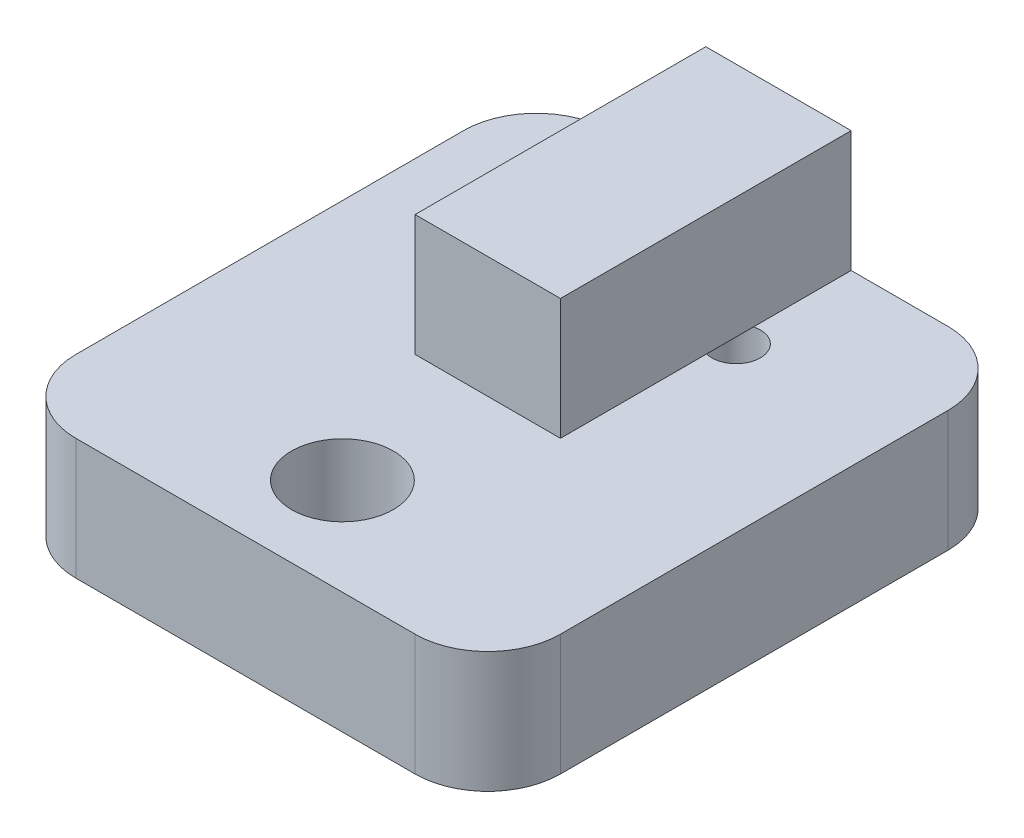
ISO-10303-21;
HEADER;
FILE_DESCRIPTION(('STEP AP214'),'2;1');
FILE_NAME('part.step','',(''),(''),'','','');
FILE_SCHEMA(('AUTOMOTIVE_DESIGN { 1 0 10303 214 1 1 1 1 }'));
ENDSEC;
DATA;
#1=APPLICATION_CONTEXT('core data for automotive mechanical design processes');
#2=APPLICATION_PROTOCOL_DEFINITION('international standard','automotive_design',2000,#1);
#3=PRODUCT_CONTEXT('',#1,'mechanical');
#4=PRODUCT('Part','Part','',(#3));
#5=PRODUCT_RELATED_PRODUCT_CATEGORY('part','',(#4));
#6=PRODUCT_DEFINITION_FORMATION('','',#4);
#7=PRODUCT_DEFINITION_CONTEXT('part definition',#1,'design');
#8=PRODUCT_DEFINITION('design','',#6,#7);
#9=PRODUCT_DEFINITION_SHAPE('','',#8);
#10=(LENGTH_UNIT() NAMED_UNIT(*) SI_UNIT(.MILLI.,.METRE.));
#11=(NAMED_UNIT(*) PLANE_ANGLE_UNIT() SI_UNIT($,.RADIAN.));
#12=(NAMED_UNIT(*) SI_UNIT($,.STERADIAN.) SOLID_ANGLE_UNIT());
#13=UNCERTAINTY_MEASURE_WITH_UNIT(LENGTH_MEASURE(1.E-05),#10,'distance_accuracy_value','');
#14=(GEOMETRIC_REPRESENTATION_CONTEXT(3) GLOBAL_UNCERTAINTY_ASSIGNED_CONTEXT((#13)) GLOBAL_UNIT_ASSIGNED_CONTEXT((#10,
#11,#12)) REPRESENTATION_CONTEXT('',''));
#15=CARTESIAN_POINT('',(0.,0.,0.));
#16=DIRECTION('',(0.,0.,1.));
#17=DIRECTION('',(1.,0.,0.));
#18=AXIS2_PLACEMENT_3D('',#15,#16,#17);
#19=CARTESIAN_POINT('',(0.,5.,0.));
#20=DIRECTION('',(0.,1.,0.));
#21=DIRECTION('',(0.,0.,1.));
#22=AXIS2_PLACEMENT_3D('',#19,#20,#21);
#23=PLANE('',#22);
#24=CARTESIAN_POINT('',(10.,5.,-4.));
#25=DIRECTION('',(0.,1.,0.));
#26=DIRECTION('',(0.,0.,1.));
#27=AXIS2_PLACEMENT_3D('',#24,#25,#26);
#28=CIRCLE('',#27,2.1);
#29=CARTESIAN_POINT('',(10.,5.,-1.9));
#30=VERTEX_POINT('',#29);
#31=EDGE_CURVE('E266',#30,#30,#28,.T.);
#32=ORIENTED_EDGE('',*,*,#31,.F.);
#33=EDGE_LOOP('',(#32));
#34=FACE_BOUND('',#33,.T.);
#35=DIRECTION('',(1.,0.,0.));
#36=VECTOR('',#35,1.);
#37=CARTESIAN_POINT('',(0.,5.,0.));
#38=LINE('',#37,#36);
#39=CARTESIAN_POINT('',(3.,5.,0.));
#40=VERTEX_POINT('',#39);
#41=CARTESIAN_POINT('',(17.,5.,0.));
#42=VERTEX_POINT('',#41);
#43=EDGE_CURVE('E268',#40,#42,#38,.T.);
#44=ORIENTED_EDGE('',*,*,#43,.T.);
#45=CARTESIAN_POINT('',(17.,5.,-3.));
#46=DIRECTION('',(0.,1.,0.));
#47=DIRECTION('',(0.,0.,1.));
#48=AXIS2_PLACEMENT_3D('',#45,#46,#47);
#49=CIRCLE('',#48,3.);
#50=CARTESIAN_POINT('',(20.,5.,-3.));
#51=VERTEX_POINT('',#50);
#52=EDGE_CURVE('E280',#42,#51,#49,.T.);
#53=ORIENTED_EDGE('',*,*,#52,.T.);
#54=DIRECTION('',(0.,0.,-1.));
#55=VECTOR('',#54,1.);
#56=CARTESIAN_POINT('',(20.,5.,0.));
#57=LINE('',#56,#55);
#58=CARTESIAN_POINT('',(20.,5.,-19.));
#59=VERTEX_POINT('',#58);
#60=EDGE_CURVE('E210',#51,#59,#57,.T.);
#61=ORIENTED_EDGE('',*,*,#60,.T.);
#62=CARTESIAN_POINT('',(17.,5.,-19.));
#63=DIRECTION('',(0.,1.,0.));
#64=DIRECTION('',(0.,0.,1.));
#65=AXIS2_PLACEMENT_3D('',#62,#63,#64);
#66=CIRCLE('',#65,3.);
#67=CARTESIAN_POINT('',(17.,5.,-22.));
#68=VERTEX_POINT('',#67);
#69=EDGE_CURVE('E200',#59,#68,#66,.T.);
#70=ORIENTED_EDGE('',*,*,#69,.T.);
#71=DIRECTION('',(1.,0.,0.));
#72=VECTOR('',#71,1.);
#73=CARTESIAN_POINT('',(0.,5.,-22.));
#74=LINE('',#73,#72);
#75=CARTESIAN_POINT('',(13.,5.,-22.));
#76=VERTEX_POINT('',#75);
#77=EDGE_CURVE('E205',#76,#68,#74,.T.);
#78=ORIENTED_EDGE('',*,*,#77,.F.);
#79=DIRECTION('',(0.,0.,1.));
#80=VECTOR('',#79,1.);
#81=CARTESIAN_POINT('',(13.,5.,0.));
#82=LINE('',#81,#80);
#83=CARTESIAN_POINT('',(13.,5.,-17.9682458365519));
#84=VERTEX_POINT('',#83);
#85=EDGE_CURVE('E144',#76,#84,#82,.T.);
#86=ORIENTED_EDGE('',*,*,#85,.T.);
#87=CARTESIAN_POINT('',(13.25,5.,-17.));
#88=DIRECTION('',(0.,1.,0.));
#89=DIRECTION('',(0.,0.,1.));
#90=AXIS2_PLACEMENT_3D('',#87,#88,#89);
#91=CIRCLE('',#90,1.);
#92=CARTESIAN_POINT('',(13.,5.,-16.0317541634481));
#93=VERTEX_POINT('',#92);
#94=EDGE_CURVE('E234',#84,#93,#91,.F.);
#95=ORIENTED_EDGE('',*,*,#94,.T.);
#96=CARTESIAN_POINT('',(13.,5.,-10.));
#97=VERTEX_POINT('',#96);
#98=EDGE_CURVE('E174',#93,#97,#82,.T.);
#99=ORIENTED_EDGE('',*,*,#98,.T.);
#100=DIRECTION('',(1.,0.,0.));
#101=VECTOR('',#100,1.);
#102=CARTESIAN_POINT('',(0.,5.,-10.));
#103=LINE('',#102,#101);
#104=CARTESIAN_POINT('',(6.99999999999999,5.,-10.));
#105=VERTEX_POINT('',#104);
#106=EDGE_CURVE('E158',#105,#97,#103,.T.);
#107=ORIENTED_EDGE('',*,*,#106,.F.);
#108=DIRECTION('',(0.,0.,1.));
#109=VECTOR('',#108,1.);
#110=CARTESIAN_POINT('',(7.,5.,0.));
#111=LINE('',#110,#109);
#112=CARTESIAN_POINT('',(6.99999999999999,5.,-16.0317541634481));
#113=VERTEX_POINT('',#112);
#114=EDGE_CURVE('E264',#113,#105,#111,.T.);
#115=ORIENTED_EDGE('',*,*,#114,.F.);
#116=CARTESIAN_POINT('',(6.75,5.,-17.));
#117=DIRECTION('',(0.,1.,0.));
#118=DIRECTION('',(0.,0.,1.));
#119=AXIS2_PLACEMENT_3D('',#116,#117,#118);
#120=CIRCLE('',#119,1.);
#121=CARTESIAN_POINT('',(6.99999999999999,5.,-17.9682458365519));
#122=VERTEX_POINT('',#121);
#123=EDGE_CURVE('E265',#122,#113,#120,.T.);
#124=ORIENTED_EDGE('',*,*,#123,.F.);
#125=CARTESIAN_POINT('',(6.99999999999999,5.,-22.));
#126=VERTEX_POINT('',#125);
#127=EDGE_CURVE('E219',#126,#122,#111,.T.);
#128=ORIENTED_EDGE('',*,*,#127,.F.);
#129=CARTESIAN_POINT('',(3.,5.,-22.));
#130=VERTEX_POINT('',#129);
#131=EDGE_CURVE('E201',#130,#126,#74,.T.);
#132=ORIENTED_EDGE('',*,*,#131,.F.);
#133=CARTESIAN_POINT('',(3.,5.,-19.));
#134=DIRECTION('',(0.,1.,0.));
#135=DIRECTION('',(0.,0.,1.));
#136=AXIS2_PLACEMENT_3D('',#133,#134,#135);
#137=CIRCLE('',#136,3.);
#138=CARTESIAN_POINT('',(0.,5.,-19.));
#139=VERTEX_POINT('',#138);
#140=EDGE_CURVE('E50',#130,#139,#137,.T.);
#141=ORIENTED_EDGE('',*,*,#140,.T.);
#142=DIRECTION('',(0.,0.,-1.));
#143=VECTOR('',#142,1.);
#144=CARTESIAN_POINT('',(0.,5.,0.));
#145=LINE('',#144,#143);
#146=CARTESIAN_POINT('',(0.,5.,-3.));
#147=VERTEX_POINT('',#146);
#148=EDGE_CURVE('E204',#147,#139,#145,.T.);
#149=ORIENTED_EDGE('',*,*,#148,.F.);
#150=CARTESIAN_POINT('',(3.,5.,-3.));
#151=DIRECTION('',(0.,1.,0.));
#152=DIRECTION('',(0.,0.,1.));
#153=AXIS2_PLACEMENT_3D('',#150,#151,#152);
#154=CIRCLE('',#153,3.);
#155=EDGE_CURVE('E283',#147,#40,#154,.T.);
#156=ORIENTED_EDGE('',*,*,#155,.T.);
#157=EDGE_LOOP('',(#44,#53,#61,#70,#78,#86,#95,#99,#107,#115,#124,#128,#132,#141,#149,#156));
#158=FACE_BOUND('',#157,.T.);
#159=ADVANCED_FACE('F35',(#34,#158),#23,.T.);
#160=CARTESIAN_POINT('',(20.,5.,0.));
#161=DIRECTION('',(-1.,0.,0.));
#162=DIRECTION('',(0.,0.,1.));
#163=AXIS2_PLACEMENT_3D('',#160,#161,#162);
#164=PLANE('',#163);
#165=ORIENTED_EDGE('',*,*,#60,.F.);
#166=DIRECTION('',(0.,-1.,0.));
#167=VECTOR('',#166,1.);
#168=CARTESIAN_POINT('',(20.,5.,-3.));
#169=LINE('',#168,#167);
#170=CARTESIAN_POINT('',(20.,0.,-3.));
#171=VERTEX_POINT('',#170);
#172=EDGE_CURVE('E184',#51,#171,#169,.T.);
#173=ORIENTED_EDGE('',*,*,#172,.T.);
#174=DIRECTION('',(0.,0.,-1.));
#175=VECTOR('',#174,1.);
#176=CARTESIAN_POINT('',(20.,0.,0.));
#177=LINE('',#176,#175);
#178=CARTESIAN_POINT('',(20.,0.,-19.));
#179=VERTEX_POINT('',#178);
#180=EDGE_CURVE('E256',#171,#179,#177,.T.);
#181=ORIENTED_EDGE('',*,*,#180,.T.);
#182=DIRECTION('',(0.,-1.,0.));
#183=VECTOR('',#182,1.);
#184=CARTESIAN_POINT('',(20.,5.,-19.));
#185=LINE('',#184,#183);
#186=EDGE_CURVE('E182',#179,#59,#185,.F.);
#187=ORIENTED_EDGE('',*,*,#186,.T.);
#188=EDGE_LOOP('',(#165,#173,#181,#187));
#189=FACE_BOUND('',#188,.T.);
#190=ADVANCED_FACE('F300',(#189),#164,.F.);
#191=CARTESIAN_POINT('',(0.,5.,-22.));
#192=DIRECTION('',(0.,0.,-1.));
#193=DIRECTION('',(-1.,0.,0.));
#194=AXIS2_PLACEMENT_3D('',#191,#192,#193);
#195=PLANE('',#194);
#196=DIRECTION('',(1.,0.,0.));
#197=VECTOR('',#196,1.);
#198=CARTESIAN_POINT('',(0.,0.,-22.));
#199=LINE('',#198,#197);
#200=CARTESIAN_POINT('',(3.,0.,-22.));
#201=VERTEX_POINT('',#200);
#202=CARTESIAN_POINT('',(17.,0.,-22.));
#203=VERTEX_POINT('',#202);
#204=EDGE_CURVE('E253',#201,#203,#199,.T.);
#205=ORIENTED_EDGE('',*,*,#204,.F.);
#206=DIRECTION('',(0.,-1.,0.));
#207=VECTOR('',#206,1.);
#208=CARTESIAN_POINT('',(3.,5.,-22.));
#209=LINE('',#208,#207);
#210=EDGE_CURVE('E11',#201,#130,#209,.F.);
#211=ORIENTED_EDGE('',*,*,#210,.T.);
#212=ORIENTED_EDGE('',*,*,#131,.T.);
#213=DIRECTION('',(0.,-1.,0.));
#214=VECTOR('',#213,1.);
#215=CARTESIAN_POINT('',(6.99999999999999,10.,-22.));
#216=LINE('',#215,#214);
#217=CARTESIAN_POINT('',(6.99999999999999,10.,-22.));
#218=VERTEX_POINT('',#217);
#219=EDGE_CURVE('E149',#218,#126,#216,.T.);
#220=ORIENTED_EDGE('',*,*,#219,.F.);
#221=DIRECTION('',(1.,0.,0.));
#222=VECTOR('',#221,1.);
#223=CARTESIAN_POINT('',(0.,10.,-22.));
#224=LINE('',#223,#222);
#225=CARTESIAN_POINT('',(13.,10.,-22.));
#226=VERTEX_POINT('',#225);
#227=EDGE_CURVE('E154',#218,#226,#224,.T.);
#228=ORIENTED_EDGE('',*,*,#227,.T.);
#229=DIRECTION('',(0.,-1.,0.));
#230=VECTOR('',#229,1.);
#231=CARTESIAN_POINT('',(13.,10.,-22.));
#232=LINE('',#231,#230);
#233=EDGE_CURVE('E138',#226,#76,#232,.T.);
#234=ORIENTED_EDGE('',*,*,#233,.T.);
#235=ORIENTED_EDGE('',*,*,#77,.T.);
#236=DIRECTION('',(0.,-1.,0.));
#237=VECTOR('',#236,1.);
#238=CARTESIAN_POINT('',(17.,0.,-22.));
#239=LINE('',#238,#237);
#240=EDGE_CURVE('E43',#68,#203,#239,.T.);
#241=ORIENTED_EDGE('',*,*,#240,.T.);
#242=EDGE_LOOP('',(#205,#211,#212,#220,#228,#234,#235,#241));
#243=FACE_BOUND('',#242,.T.);
#244=ADVANCED_FACE('F161',(#243),#195,.T.);
#245=CARTESIAN_POINT('',(0.,5.,0.));
#246=DIRECTION('',(-1.,0.,0.));
#247=DIRECTION('',(0.,0.,1.));
#248=AXIS2_PLACEMENT_3D('',#245,#246,#247);
#249=PLANE('',#248);
#250=DIRECTION('',(0.,0.,-1.));
#251=VECTOR('',#250,1.);
#252=CARTESIAN_POINT('',(0.,0.,0.));
#253=LINE('',#252,#251);
#254=CARTESIAN_POINT('',(0.,0.,-3.));
#255=VERTEX_POINT('',#254);
#256=CARTESIAN_POINT('',(0.,0.,-19.));
#257=VERTEX_POINT('',#256);
#258=EDGE_CURVE('E248',#255,#257,#253,.T.);
#259=ORIENTED_EDGE('',*,*,#258,.F.);
#260=DIRECTION('',(0.,-1.,0.));
#261=VECTOR('',#260,1.);
#262=CARTESIAN_POINT('',(0.,5.,-3.));
#263=LINE('',#262,#261);
#264=EDGE_CURVE('E57',#255,#147,#263,.F.);
#265=ORIENTED_EDGE('',*,*,#264,.T.);
#266=ORIENTED_EDGE('',*,*,#148,.T.);
#267=DIRECTION('',(0.,-1.,0.));
#268=VECTOR('',#267,1.);
#269=CARTESIAN_POINT('',(0.,5.,-19.));
#270=LINE('',#269,#268);
#271=EDGE_CURVE('E275',#139,#257,#270,.T.);
#272=ORIENTED_EDGE('',*,*,#271,.T.);
#273=EDGE_LOOP('',(#259,#265,#266,#272));
#274=FACE_BOUND('',#273,.T.);
#275=ADVANCED_FACE('F274',(#274),#249,.T.);
#276=CARTESIAN_POINT('',(10.,5.,-4.));
#277=DIRECTION('',(0.,-1.,0.));
#278=DIRECTION('',(0.,0.,-1.));
#279=AXIS2_PLACEMENT_3D('',#276,#277,#278);
#280=CYLINDRICAL_SURFACE('',#279,2.1);
#281=ORIENTED_EDGE('',*,*,#31,.T.);
#282=EDGE_LOOP('',(#281));
#283=FACE_BOUND('',#282,.T.);
#284=CARTESIAN_POINT('',(10.,0.,-4.));
#285=DIRECTION('',(0.,1.,0.));
#286=DIRECTION('',(0.,0.,1.));
#287=AXIS2_PLACEMENT_3D('',#284,#285,#286);
#288=CIRCLE('',#287,2.1);
#289=CARTESIAN_POINT('',(10.,0.,-1.9));
#290=VERTEX_POINT('',#289);
#291=EDGE_CURVE('E240',#290,#290,#288,.T.);
#292=ORIENTED_EDGE('',*,*,#291,.F.);
#293=EDGE_LOOP('',(#292));
#294=FACE_BOUND('',#293,.T.);
#295=ADVANCED_FACE('F338',(#283,#294),#280,.F.);
#296=CARTESIAN_POINT('',(0.,5.,0.));
#297=DIRECTION('',(0.,0.,-1.));
#298=DIRECTION('',(-1.,0.,0.));
#299=AXIS2_PLACEMENT_3D('',#296,#297,#298);
#300=PLANE('',#299);
#301=DIRECTION('',(1.,0.,0.));
#302=VECTOR('',#301,1.);
#303=CARTESIAN_POINT('',(0.,0.,0.));
#304=LINE('',#303,#302);
#305=CARTESIAN_POINT('',(3.,0.,0.));
#306=VERTEX_POINT('',#305);
#307=CARTESIAN_POINT('',(17.,0.,0.));
#308=VERTEX_POINT('',#307);
#309=EDGE_CURVE('E244',#306,#308,#304,.T.);
#310=ORIENTED_EDGE('',*,*,#309,.T.);
#311=DIRECTION('',(0.,-1.,0.));
#312=VECTOR('',#311,1.);
#313=CARTESIAN_POINT('',(17.,5.,0.));
#314=LINE('',#313,#312);
#315=EDGE_CURVE('E198',#308,#42,#314,.F.);
#316=ORIENTED_EDGE('',*,*,#315,.T.);
#317=ORIENTED_EDGE('',*,*,#43,.F.);
#318=DIRECTION('',(0.,-1.,0.));
#319=VECTOR('',#318,1.);
#320=CARTESIAN_POINT('',(3.,0.,0.));
#321=LINE('',#320,#319);
#322=EDGE_CURVE('E195',#40,#306,#321,.T.);
#323=ORIENTED_EDGE('',*,*,#322,.T.);
#324=EDGE_LOOP('',(#310,#316,#317,#323));
#325=FACE_BOUND('',#324,.T.);
#326=ADVANCED_FACE('F305',(#325),#300,.F.);
#327=CARTESIAN_POINT('',(13.25,5.,-17.));
#328=DIRECTION('',(0.,-1.,0.));
#329=DIRECTION('',(0.,0.,-1.));
#330=AXIS2_PLACEMENT_3D('',#327,#328,#329);
#331=CYLINDRICAL_SURFACE('',#330,1.);
#332=EDGE_CURVE('E232',#93,#84,#91,.F.);
#333=ORIENTED_EDGE('',*,*,#332,.F.);
#334=ORIENTED_EDGE('',*,*,#94,.F.);
#335=EDGE_LOOP('',(#333,#334));
#336=FACE_BOUND('',#335,.T.);
#337=CARTESIAN_POINT('',(13.25,0.,-17.));
#338=DIRECTION('',(0.,1.,0.));
#339=DIRECTION('',(0.,0.,1.));
#340=AXIS2_PLACEMENT_3D('',#337,#338,#339);
#341=CIRCLE('',#340,1.);
#342=CARTESIAN_POINT('',(13.25,0.,-16.));
#343=VERTEX_POINT('',#342);
#344=EDGE_CURVE('E148',#343,#343,#341,.F.);
#345=ORIENTED_EDGE('',*,*,#344,.T.);
#346=EDGE_LOOP('',(#345));
#347=FACE_BOUND('',#346,.T.);
#348=ADVANCED_FACE('F336',(#336,#347),#331,.F.);
#349=CARTESIAN_POINT('',(6.75,5.,-17.));
#350=DIRECTION('',(0.,-1.,0.));
#351=DIRECTION('',(0.,0.,-1.));
#352=AXIS2_PLACEMENT_3D('',#349,#350,#351);
#353=CYLINDRICAL_SURFACE('',#352,1.);
#354=EDGE_CURVE('E261',#113,#122,#120,.T.);
#355=ORIENTED_EDGE('',*,*,#354,.T.);
#356=ORIENTED_EDGE('',*,*,#123,.T.);
#357=EDGE_LOOP('',(#355,#356));
#358=FACE_BOUND('',#357,.T.);
#359=CARTESIAN_POINT('',(6.75,0.,-17.));
#360=DIRECTION('',(0.,1.,0.));
#361=DIRECTION('',(0.,0.,1.));
#362=AXIS2_PLACEMENT_3D('',#359,#360,#361);
#363=CIRCLE('',#362,1.);
#364=CARTESIAN_POINT('',(6.75,0.,-16.));
#365=VERTEX_POINT('',#364);
#366=EDGE_CURVE('E217',#365,#365,#363,.T.);
#367=ORIENTED_EDGE('',*,*,#366,.F.);
#368=EDGE_LOOP('',(#367));
#369=FACE_BOUND('',#368,.T.);
#370=ADVANCED_FACE('F332',(#358,#369),#353,.F.);
#371=CARTESIAN_POINT('',(0.,0.,0.));
#372=DIRECTION('',(0.,1.,0.));
#373=DIRECTION('',(0.,0.,1.));
#374=AXIS2_PLACEMENT_3D('',#371,#372,#373);
#375=PLANE('',#374);
#376=ORIENTED_EDGE('',*,*,#344,.F.);
#377=EDGE_LOOP('',(#376));
#378=FACE_BOUND('',#377,.T.);
#379=ORIENTED_EDGE('',*,*,#180,.F.);
#380=CARTESIAN_POINT('',(17.,0.,-3.));
#381=DIRECTION('',(0.,1.,0.));
#382=DIRECTION('',(0.,0.,1.));
#383=AXIS2_PLACEMENT_3D('',#380,#381,#382);
#384=CIRCLE('',#383,3.);
#385=EDGE_CURVE('E193',#171,#308,#384,.F.);
#386=ORIENTED_EDGE('',*,*,#385,.T.);
#387=ORIENTED_EDGE('',*,*,#309,.F.);
#388=CARTESIAN_POINT('',(3.,0.,-3.));
#389=DIRECTION('',(0.,1.,0.));
#390=DIRECTION('',(0.,0.,1.));
#391=AXIS2_PLACEMENT_3D('',#388,#389,#390);
#392=CIRCLE('',#391,3.);
#393=EDGE_CURVE('E191',#306,#255,#392,.F.);
#394=ORIENTED_EDGE('',*,*,#393,.T.);
#395=ORIENTED_EDGE('',*,*,#258,.T.);
#396=CARTESIAN_POINT('',(3.,0.,-19.));
#397=DIRECTION('',(0.,1.,0.));
#398=DIRECTION('',(0.,0.,1.));
#399=AXIS2_PLACEMENT_3D('',#396,#397,#398);
#400=CIRCLE('',#399,3.);
#401=EDGE_CURVE('E189',#257,#201,#400,.F.);
#402=ORIENTED_EDGE('',*,*,#401,.T.);
#403=ORIENTED_EDGE('',*,*,#204,.T.);
#404=CARTESIAN_POINT('',(17.,0.,-19.));
#405=DIRECTION('',(0.,1.,0.));
#406=DIRECTION('',(0.,0.,1.));
#407=AXIS2_PLACEMENT_3D('',#404,#405,#406);
#408=CIRCLE('',#407,3.);
#409=EDGE_CURVE('E187',#203,#179,#408,.F.);
#410=ORIENTED_EDGE('',*,*,#409,.T.);
#411=EDGE_LOOP('',(#379,#386,#387,#394,#395,#402,#403,#410));
#412=FACE_BOUND('',#411,.T.);
#413=ORIENTED_EDGE('',*,*,#291,.T.);
#414=EDGE_LOOP('',(#413));
#415=FACE_BOUND('',#414,.T.);
#416=ORIENTED_EDGE('',*,*,#366,.T.);
#417=EDGE_LOOP('',(#416));
#418=FACE_BOUND('',#417,.T.);
#419=ADVANCED_FACE('F292',(#378,#412,#415,#418),#375,.F.);
#420=CARTESIAN_POINT('',(0.,5.,0.));
#421=DIRECTION('',(0.,1.,0.));
#422=DIRECTION('',(0.,0.,1.));
#423=AXIS2_PLACEMENT_3D('',#420,#421,#422);
#424=PLANE('',#423);
#425=EDGE_CURVE('E170',#84,#93,#82,.T.);
#426=ORIENTED_EDGE('',*,*,#425,.T.);
#427=ORIENTED_EDGE('',*,*,#332,.T.);
#428=EDGE_LOOP('',(#426,#427));
#429=FACE_BOUND('',#428,.T.);
#430=ADVANCED_FACE('F317',(#429),#424,.F.);
#431=CARTESIAN_POINT('',(13.,10.,0.));
#432=DIRECTION('',(1.,0.,0.));
#433=DIRECTION('',(0.,0.,-1.));
#434=AXIS2_PLACEMENT_3D('',#431,#432,#433);
#435=PLANE('',#434);
#436=ORIENTED_EDGE('',*,*,#85,.F.);
#437=ORIENTED_EDGE('',*,*,#233,.F.);
#438=DIRECTION('',(0.,0.,1.));
#439=VECTOR('',#438,1.);
#440=CARTESIAN_POINT('',(13.,10.,0.));
#441=LINE('',#440,#439);
#442=CARTESIAN_POINT('',(13.,10.,-10.));
#443=VERTEX_POINT('',#442);
#444=EDGE_CURVE('E142',#226,#443,#441,.T.);
#445=ORIENTED_EDGE('',*,*,#444,.T.);
#446=DIRECTION('',(0.,-1.,0.));
#447=VECTOR('',#446,1.);
#448=CARTESIAN_POINT('',(13.,10.,-10.));
#449=LINE('',#448,#447);
#450=EDGE_CURVE('E169',#443,#97,#449,.T.);
#451=ORIENTED_EDGE('',*,*,#450,.T.);
#452=ORIENTED_EDGE('',*,*,#98,.F.);
#453=ORIENTED_EDGE('',*,*,#425,.F.);
#454=EDGE_LOOP('',(#436,#437,#445,#451,#452,#453));
#455=FACE_BOUND('',#454,.T.);
#456=ADVANCED_FACE('F140',(#455),#435,.T.);
#457=CARTESIAN_POINT('',(7.,10.,0.));
#458=DIRECTION('',(1.,0.,0.));
#459=DIRECTION('',(0.,0.,-1.));
#460=AXIS2_PLACEMENT_3D('',#457,#458,#459);
#461=PLANE('',#460);
#462=ORIENTED_EDGE('',*,*,#127,.T.);
#463=EDGE_CURVE('E175',#122,#113,#111,.T.);
#464=ORIENTED_EDGE('',*,*,#463,.T.);
#465=ORIENTED_EDGE('',*,*,#114,.T.);
#466=DIRECTION('',(0.,-1.,0.));
#467=VECTOR('',#466,1.);
#468=CARTESIAN_POINT('',(6.99999999999999,10.,-10.));
#469=LINE('',#468,#467);
#470=CARTESIAN_POINT('',(6.99999999999999,10.,-10.));
#471=VERTEX_POINT('',#470);
#472=EDGE_CURVE('E223',#471,#105,#469,.T.);
#473=ORIENTED_EDGE('',*,*,#472,.F.);
#474=DIRECTION('',(0.,0.,1.));
#475=VECTOR('',#474,1.);
#476=CARTESIAN_POINT('',(7.,10.,0.));
#477=LINE('',#476,#475);
#478=EDGE_CURVE('E164',#218,#471,#477,.T.);
#479=ORIENTED_EDGE('',*,*,#478,.F.);
#480=ORIENTED_EDGE('',*,*,#219,.T.);
#481=EDGE_LOOP('',(#462,#464,#465,#473,#479,#480));
#482=FACE_BOUND('',#481,.T.);
#483=ADVANCED_FACE('F358',(#482),#461,.F.);
#484=CARTESIAN_POINT('',(0.,10.,-10.));
#485=DIRECTION('',(0.,0.,-1.));
#486=DIRECTION('',(-1.,0.,0.));
#487=AXIS2_PLACEMENT_3D('',#484,#485,#486);
#488=PLANE('',#487);
#489=ORIENTED_EDGE('',*,*,#106,.T.);
#490=ORIENTED_EDGE('',*,*,#450,.F.);
#491=DIRECTION('',(1.,0.,0.));
#492=VECTOR('',#491,1.);
#493=CARTESIAN_POINT('',(0.,10.,-10.));
#494=LINE('',#493,#492);
#495=EDGE_CURVE('E156',#471,#443,#494,.T.);
#496=ORIENTED_EDGE('',*,*,#495,.F.);
#497=ORIENTED_EDGE('',*,*,#472,.T.);
#498=EDGE_LOOP('',(#489,#490,#496,#497));
#499=FACE_BOUND('',#498,.T.);
#500=ADVANCED_FACE('F361',(#499),#488,.F.);
#501=CARTESIAN_POINT('',(0.,10.,0.));
#502=DIRECTION('',(0.,1.,0.));
#503=DIRECTION('',(0.,0.,1.));
#504=AXIS2_PLACEMENT_3D('',#501,#502,#503);
#505=PLANE('',#504);
#506=ORIENTED_EDGE('',*,*,#444,.F.);
#507=ORIENTED_EDGE('',*,*,#227,.F.);
#508=ORIENTED_EDGE('',*,*,#478,.T.);
#509=ORIENTED_EDGE('',*,*,#495,.T.);
#510=EDGE_LOOP('',(#506,#507,#508,#509));
#511=FACE_BOUND('',#510,.T.);
#512=ADVANCED_FACE('F153',(#511),#505,.T.);
#513=ORIENTED_EDGE('',*,*,#354,.F.);
#514=ORIENTED_EDGE('',*,*,#463,.F.);
#515=EDGE_LOOP('',(#513,#514));
#516=FACE_BOUND('',#515,.T.);
#517=ADVANCED_FACE('F308',(#516),#424,.F.);
#518=CARTESIAN_POINT('',(17.,5.,-3.));
#519=DIRECTION('',(0.,-1.,0.));
#520=DIRECTION('',(0.,0.,-1.));
#521=AXIS2_PLACEMENT_3D('',#518,#519,#520);
#522=CYLINDRICAL_SURFACE('',#521,3.);
#523=ORIENTED_EDGE('',*,*,#52,.F.);
#524=ORIENTED_EDGE('',*,*,#315,.F.);
#525=ORIENTED_EDGE('',*,*,#385,.F.);
#526=ORIENTED_EDGE('',*,*,#172,.F.);
#527=EDGE_LOOP('',(#523,#524,#525,#526));
#528=FACE_BOUND('',#527,.T.);
#529=ADVANCED_FACE('F306',(#528),#522,.T.);
#530=CARTESIAN_POINT('',(3.,5.,-3.));
#531=DIRECTION('',(0.,1.,0.));
#532=DIRECTION('',(0.,0.,1.));
#533=AXIS2_PLACEMENT_3D('',#530,#531,#532);
#534=CYLINDRICAL_SURFACE('',#533,3.);
#535=ORIENTED_EDGE('',*,*,#155,.F.);
#536=ORIENTED_EDGE('',*,*,#264,.F.);
#537=ORIENTED_EDGE('',*,*,#393,.F.);
#538=ORIENTED_EDGE('',*,*,#322,.F.);
#539=EDGE_LOOP('',(#535,#536,#537,#538));
#540=FACE_BOUND('',#539,.T.);
#541=ADVANCED_FACE('F295',(#540),#534,.T.);
#542=CARTESIAN_POINT('',(3.,5.,-19.));
#543=DIRECTION('',(0.,-1.,0.));
#544=DIRECTION('',(0.,0.,-1.));
#545=AXIS2_PLACEMENT_3D('',#542,#543,#544);
#546=CYLINDRICAL_SURFACE('',#545,3.);
#547=ORIENTED_EDGE('',*,*,#140,.F.);
#548=ORIENTED_EDGE('',*,*,#210,.F.);
#549=ORIENTED_EDGE('',*,*,#401,.F.);
#550=ORIENTED_EDGE('',*,*,#271,.F.);
#551=EDGE_LOOP('',(#547,#548,#549,#550));
#552=FACE_BOUND('',#551,.T.);
#553=ADVANCED_FACE('F278',(#552),#546,.T.);
#554=CARTESIAN_POINT('',(17.,5.,-19.));
#555=DIRECTION('',(0.,1.,0.));
#556=DIRECTION('',(0.,0.,1.));
#557=AXIS2_PLACEMENT_3D('',#554,#555,#556);
#558=CYLINDRICAL_SURFACE('',#557,3.);
#559=ORIENTED_EDGE('',*,*,#69,.F.);
#560=ORIENTED_EDGE('',*,*,#186,.F.);
#561=ORIENTED_EDGE('',*,*,#409,.F.);
#562=ORIENTED_EDGE('',*,*,#240,.F.);
#563=EDGE_LOOP('',(#559,#560,#561,#562));
#564=FACE_BOUND('',#563,.T.);
#565=ADVANCED_FACE('F37',(#564),#558,.T.);
#566=CLOSED_SHELL('',(#159,#190,#244,#275,#295,#326,#348,#370,#419,#430,#456,#483,#500,#512,
#517,#529,#541,#553,#565));
#567=MANIFOLD_SOLID_BREP('B2',#566);
#568=ADVANCED_BREP_SHAPE_REPRESENTATION('',(#18,#567),#14);
#569=SHAPE_DEFINITION_REPRESENTATION(#9,#568);
ENDSEC;
END-ISO-10303-21;
